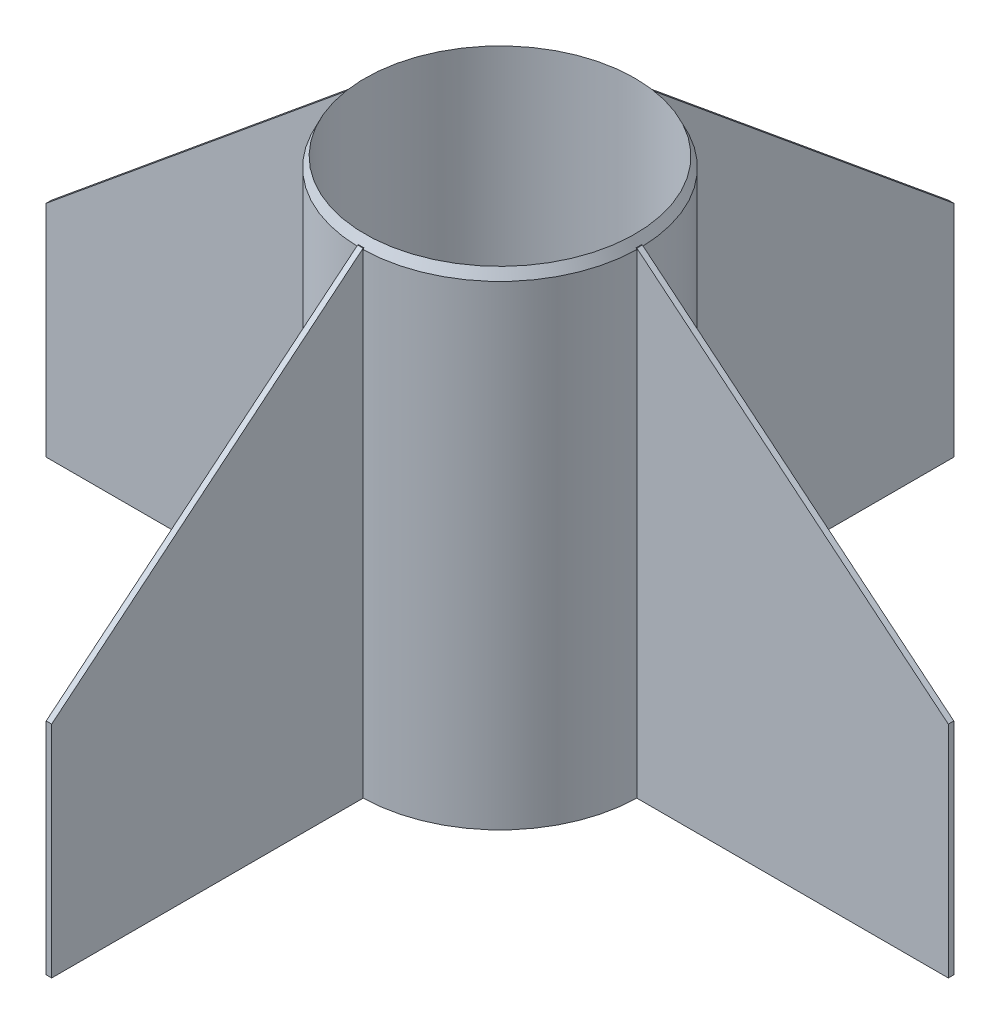
ISO-10303-21;
HEADER;
FILE_DESCRIPTION(('STEP AP214'),'2;1');
FILE_NAME('part.step','',(''),(''),'','','');
FILE_SCHEMA(('AUTOMOTIVE_DESIGN { 1 0 10303 214 1 1 1 1 }'));
ENDSEC;
DATA;
#1=APPLICATION_CONTEXT('core data for automotive mechanical design processes');
#2=APPLICATION_PROTOCOL_DEFINITION('international standard','automotive_design',2000,#1);
#3=PRODUCT_CONTEXT('',#1,'mechanical');
#4=PRODUCT('Part','Part','',(#3));
#5=PRODUCT_RELATED_PRODUCT_CATEGORY('part','',(#4));
#6=PRODUCT_DEFINITION_FORMATION('','',#4);
#7=PRODUCT_DEFINITION_CONTEXT('part definition',#1,'design');
#8=PRODUCT_DEFINITION('design','',#6,#7);
#9=PRODUCT_DEFINITION_SHAPE('','',#8);
#10=(LENGTH_UNIT() NAMED_UNIT(*) SI_UNIT(.MILLI.,.METRE.));
#11=(NAMED_UNIT(*) PLANE_ANGLE_UNIT() SI_UNIT($,.RADIAN.));
#12=(NAMED_UNIT(*) SI_UNIT($,.STERADIAN.) SOLID_ANGLE_UNIT());
#13=UNCERTAINTY_MEASURE_WITH_UNIT(LENGTH_MEASURE(1.E-05),#10,'distance_accuracy_value','');
#14=(GEOMETRIC_REPRESENTATION_CONTEXT(3) GLOBAL_UNCERTAINTY_ASSIGNED_CONTEXT((#13)) GLOBAL_UNIT_ASSIGNED_CONTEXT((#10,
#11,#12)) REPRESENTATION_CONTEXT('',''));
#15=CARTESIAN_POINT('',(0.,0.,0.));
#16=DIRECTION('',(0.,0.,1.));
#17=DIRECTION('',(1.,0.,0.));
#18=AXIS2_PLACEMENT_3D('',#15,#16,#17);
#19=CARTESIAN_POINT('',(0.,260.,0.));
#20=DIRECTION('',(0.,-1.,0.));
#21=DIRECTION('',(0.,0.,-1.));
#22=AXIS2_PLACEMENT_3D('',#19,#20,#21);
#23=CYLINDRICAL_SURFACE('',#22,76.2);
#24=DIRECTION('',(0.,-1.,0.));
#25=VECTOR('',#24,1.);
#26=CARTESIAN_POINT('',(-76.1852347899513,260.,-1.5));
#27=LINE('',#26,#25);
#28=CARTESIAN_POINT('',(-76.1852347899513,0.,-1.5));
#29=VERTEX_POINT('',#28);
#30=CARTESIAN_POINT('',(-76.1852347899513,259.277465397452,-1.5));
#31=VERTEX_POINT('',#30);
#32=EDGE_CURVE('E332',#29,#31,#27,.F.);
#33=ORIENTED_EDGE('',*,*,#32,.T.);
#34=CARTESIAN_POINT('',(0.,259.277465397452,0.));
#35=DIRECTION('',(0.,1.,0.));
#36=DIRECTION('',(0.,0.,1.));
#37=AXIS2_PLACEMENT_3D('',#34,#35,#36);
#38=CIRCLE('',#37,76.2);
#39=CARTESIAN_POINT('',(-1.4999999999992,259.277465397452,-76.1852347899513));
#40=VERTEX_POINT('',#39);
#41=EDGE_CURVE('E455',#31,#40,#38,.F.);
#42=ORIENTED_EDGE('',*,*,#41,.T.);
#43=DIRECTION('',(0.,-1.,0.));
#44=VECTOR('',#43,1.);
#45=CARTESIAN_POINT('',(-1.4999999999992,260.,-76.1852347899513));
#46=LINE('',#45,#44);
#47=CARTESIAN_POINT('',(-1.4999999999992,0.,-76.1852347899513));
#48=VERTEX_POINT('',#47);
#49=EDGE_CURVE('E291',#48,#40,#46,.F.);
#50=ORIENTED_EDGE('',*,*,#49,.F.);
#51=CARTESIAN_POINT('',(0.,0.,0.));
#52=DIRECTION('',(0.,1.,0.));
#53=DIRECTION('',(0.,0.,1.));
#54=AXIS2_PLACEMENT_3D('',#51,#52,#53);
#55=CIRCLE('',#54,76.2);
#56=EDGE_CURVE('E434',#48,#29,#55,.T.);
#57=ORIENTED_EDGE('',*,*,#56,.T.);
#58=EDGE_LOOP('',(#33,#42,#50,#57));
#59=FACE_BOUND('',#58,.T.);
#60=ADVANCED_FACE('F43',(#59),#23,.T.);
#61=DIRECTION('',(0.,-1.,0.));
#62=VECTOR('',#61,1.);
#63=CARTESIAN_POINT('',(1.5000000000008,260.,-76.1852347899513));
#64=LINE('',#63,#62);
#65=CARTESIAN_POINT('',(1.5000000000008,0.,-76.1852347899513));
#66=VERTEX_POINT('',#65);
#67=CARTESIAN_POINT('',(1.5000000000008,259.277465397452,-76.1852347899513));
#68=VERTEX_POINT('',#67);
#69=EDGE_CURVE('E241',#66,#68,#64,.F.);
#70=ORIENTED_EDGE('',*,*,#69,.T.);
#71=CARTESIAN_POINT('',(0.,259.277465397452,0.));
#72=DIRECTION('',(0.,1.,0.));
#73=DIRECTION('',(0.,0.,1.));
#74=AXIS2_PLACEMENT_3D('',#71,#72,#73);
#75=CIRCLE('',#74,76.2);
#76=CARTESIAN_POINT('',(76.1852347899513,259.277465397452,-1.5));
#77=VERTEX_POINT('',#76);
#78=EDGE_CURVE('E452',#68,#77,#75,.F.);
#79=ORIENTED_EDGE('',*,*,#78,.T.);
#80=DIRECTION('',(0.,-1.,0.));
#81=VECTOR('',#80,1.);
#82=CARTESIAN_POINT('',(76.1852347899513,260.,-1.5));
#83=LINE('',#82,#81);
#84=CARTESIAN_POINT('',(76.1852347899513,0.,-1.5));
#85=VERTEX_POINT('',#84);
#86=EDGE_CURVE('E438',#85,#77,#83,.F.);
#87=ORIENTED_EDGE('',*,*,#86,.F.);
#88=EDGE_CURVE('E430',#85,#66,#55,.T.);
#89=ORIENTED_EDGE('',*,*,#88,.T.);
#90=EDGE_LOOP('',(#70,#79,#87,#89));
#91=FACE_BOUND('',#90,.T.);
#92=ADVANCED_FACE('F611',(#91),#23,.T.);
#93=DIRECTION('',(0.,-1.,0.));
#94=VECTOR('',#93,1.);
#95=CARTESIAN_POINT('',(76.1852347899513,260.,1.5));
#96=LINE('',#95,#94);
#97=CARTESIAN_POINT('',(76.1852347899513,0.,1.5));
#98=VERTEX_POINT('',#97);
#99=CARTESIAN_POINT('',(76.1852347899513,259.277465397452,1.5));
#100=VERTEX_POINT('',#99);
#101=EDGE_CURVE('E433',#98,#100,#96,.F.);
#102=ORIENTED_EDGE('',*,*,#101,.T.);
#103=CARTESIAN_POINT('',(0.,259.277465397452,0.));
#104=DIRECTION('',(0.,1.,0.));
#105=DIRECTION('',(0.,0.,1.));
#106=AXIS2_PLACEMENT_3D('',#103,#104,#105);
#107=CIRCLE('',#106,76.2);
#108=CARTESIAN_POINT('',(1.49999999999973,259.277465397452,76.1852347899513));
#109=VERTEX_POINT('',#108);
#110=EDGE_CURVE('E449',#100,#109,#107,.F.);
#111=ORIENTED_EDGE('',*,*,#110,.T.);
#112=DIRECTION('',(0.,-1.,0.));
#113=VECTOR('',#112,1.);
#114=CARTESIAN_POINT('',(1.49999999999973,260.,76.1852347899513));
#115=LINE('',#114,#113);
#116=CARTESIAN_POINT('',(1.49999999999973,0.,76.1852347899513));
#117=VERTEX_POINT('',#116);
#118=EDGE_CURVE('E384',#117,#109,#115,.F.);
#119=ORIENTED_EDGE('',*,*,#118,.F.);
#120=EDGE_CURVE('E429',#117,#98,#55,.T.);
#121=ORIENTED_EDGE('',*,*,#120,.T.);
#122=EDGE_LOOP('',(#102,#111,#119,#121));
#123=FACE_BOUND('',#122,.T.);
#124=ADVANCED_FACE('F537',(#123),#23,.T.);
#125=DIRECTION('',(0.,-1.,0.));
#126=VECTOR('',#125,1.);
#127=CARTESIAN_POINT('',(-1.50000000000027,260.,76.1852347899513));
#128=LINE('',#127,#126);
#129=CARTESIAN_POINT('',(-1.50000000000027,0.,76.1852347899513));
#130=VERTEX_POINT('',#129);
#131=CARTESIAN_POINT('',(-1.50000000000027,259.277465397452,76.1852347899513));
#132=VERTEX_POINT('',#131);
#133=EDGE_CURVE('E380',#130,#132,#128,.F.);
#134=ORIENTED_EDGE('',*,*,#133,.T.);
#135=CARTESIAN_POINT('',(0.,259.277465397452,0.));
#136=DIRECTION('',(0.,1.,0.));
#137=DIRECTION('',(0.,0.,1.));
#138=AXIS2_PLACEMENT_3D('',#135,#136,#137);
#139=CIRCLE('',#138,76.2);
#140=CARTESIAN_POINT('',(-76.1852347899513,259.277465397452,1.5));
#141=VERTEX_POINT('',#140);
#142=EDGE_CURVE('E446',#132,#141,#139,.F.);
#143=ORIENTED_EDGE('',*,*,#142,.T.);
#144=DIRECTION('',(0.,-1.,0.));
#145=VECTOR('',#144,1.);
#146=CARTESIAN_POINT('',(-76.1852347899513,260.,1.5));
#147=LINE('',#146,#145);
#148=CARTESIAN_POINT('',(-76.1852347899513,0.,1.5));
#149=VERTEX_POINT('',#148);
#150=EDGE_CURVE('E336',#149,#141,#147,.F.);
#151=ORIENTED_EDGE('',*,*,#150,.F.);
#152=EDGE_CURVE('E527',#149,#130,#55,.T.);
#153=ORIENTED_EDGE('',*,*,#152,.T.);
#154=EDGE_LOOP('',(#134,#143,#151,#153));
#155=FACE_BOUND('',#154,.T.);
#156=ADVANCED_FACE('F617',(#155),#23,.T.);
#157=CARTESIAN_POINT('',(0.,260.,0.));
#158=DIRECTION('',(0.,1.,0.));
#159=DIRECTION('',(0.,0.,1.));
#160=AXIS2_PLACEMENT_3D('',#157,#158,#159);
#161=PLANE('',#160);
#162=DIRECTION('',(-1.,0.,0.));
#163=VECTOR('',#162,1.);
#164=CARTESIAN_POINT('',(76.2,260.,-1.5));
#165=LINE('',#164,#163);
#166=CARTESIAN_POINT('',(76.2,260.,-1.5));
#167=VERTEX_POINT('',#166);
#168=CARTESIAN_POINT('',(75.8482457833937,260.,-1.5));
#169=VERTEX_POINT('',#168);
#170=EDGE_CURVE('E98',#167,#169,#165,.T.);
#171=ORIENTED_EDGE('',*,*,#170,.T.);
#172=CARTESIAN_POINT('',(0.,260.,0.));
#173=DIRECTION('',(0.,1.,0.));
#174=DIRECTION('',(0.,0.,1.));
#175=AXIS2_PLACEMENT_3D('',#172,#173,#174);
#176=CIRCLE('',#175,75.8630765815499);
#177=CARTESIAN_POINT('',(75.8482457833937,260.,1.5));
#178=VERTEX_POINT('',#177);
#179=EDGE_CURVE('E555',#169,#178,#176,.F.);
#180=ORIENTED_EDGE('',*,*,#179,.T.);
#181=DIRECTION('',(-1.,0.,0.));
#182=VECTOR('',#181,1.);
#183=CARTESIAN_POINT('',(76.2,260.,1.5));
#184=LINE('',#183,#182);
#185=CARTESIAN_POINT('',(76.2,260.,1.5));
#186=VERTEX_POINT('',#185);
#187=EDGE_CURVE('E91',#186,#178,#184,.T.);
#188=ORIENTED_EDGE('',*,*,#187,.F.);
#189=DIRECTION('',(0.,0.,1.));
#190=VECTOR('',#189,1.);
#191=CARTESIAN_POINT('',(76.2,260.,-1.5));
#192=LINE('',#191,#190);
#193=CARTESIAN_POINT('',(76.2,260.,0.));
#194=VERTEX_POINT('',#193);
#195=EDGE_CURVE('E420',#194,#186,#192,.T.);
#196=ORIENTED_EDGE('',*,*,#195,.F.);
#197=EDGE_CURVE('E421',#167,#194,#192,.T.);
#198=ORIENTED_EDGE('',*,*,#197,.F.);
#199=EDGE_LOOP('',(#171,#180,#188,#196,#198));
#200=FACE_BOUND('',#199,.T.);
#201=ADVANCED_FACE('F553',(#200),#161,.T.);
#202=CARTESIAN_POINT('',(0.,0.,0.));
#203=DIRECTION('',(0.,1.,0.));
#204=DIRECTION('',(0.,0.,1.));
#205=AXIS2_PLACEMENT_3D('',#202,#203,#204);
#206=PLANE('',#205);
#207=ORIENTED_EDGE('',*,*,#152,.F.);
#208=DIRECTION('',(-1.,0.,0.));
#209=VECTOR('',#208,1.);
#210=CARTESIAN_POINT('',(-74.2,0.,1.5));
#211=LINE('',#210,#209);
#212=CARTESIAN_POINT('',(-246.2,0.,1.5));
#213=VERTEX_POINT('',#212);
#214=EDGE_CURVE('E324',#149,#213,#211,.T.);
#215=ORIENTED_EDGE('',*,*,#214,.T.);
#216=DIRECTION('',(0.,0.,-1.));
#217=VECTOR('',#216,1.);
#218=CARTESIAN_POINT('',(-246.2,0.,1.5));
#219=LINE('',#218,#217);
#220=CARTESIAN_POINT('',(-246.2,0.,-1.5));
#221=VERTEX_POINT('',#220);
#222=EDGE_CURVE('E310',#213,#221,#219,.T.);
#223=ORIENTED_EDGE('',*,*,#222,.T.);
#224=DIRECTION('',(-1.,0.,0.));
#225=VECTOR('',#224,1.);
#226=CARTESIAN_POINT('',(-74.2,0.,-1.5));
#227=LINE('',#226,#225);
#228=EDGE_CURVE('E319',#29,#221,#227,.T.);
#229=ORIENTED_EDGE('',*,*,#228,.F.);
#230=ORIENTED_EDGE('',*,*,#56,.F.);
#231=DIRECTION('',(0.,0.,-1.));
#232=VECTOR('',#231,1.);
#233=CARTESIAN_POINT('',(-1.49999999999922,0.,-74.2));
#234=LINE('',#233,#232);
#235=CARTESIAN_POINT('',(-1.49999999999742,0.,-246.2));
#236=VERTEX_POINT('',#235);
#237=EDGE_CURVE('E255',#48,#236,#234,.T.);
#238=ORIENTED_EDGE('',*,*,#237,.T.);
#239=DIRECTION('',(1.,0.,0.));
#240=VECTOR('',#239,1.);
#241=CARTESIAN_POINT('',(-1.49999999999742,0.,-246.2));
#242=LINE('',#241,#240);
#243=CARTESIAN_POINT('',(1.50000000000258,0.,-246.2));
#244=VERTEX_POINT('',#243);
#245=EDGE_CURVE('E250',#236,#244,#242,.T.);
#246=ORIENTED_EDGE('',*,*,#245,.T.);
#247=DIRECTION('',(0.,0.,-1.));
#248=VECTOR('',#247,1.);
#249=CARTESIAN_POINT('',(1.50000000000078,0.,-74.2));
#250=LINE('',#249,#248);
#251=EDGE_CURVE('E233',#66,#244,#250,.T.);
#252=ORIENTED_EDGE('',*,*,#251,.F.);
#253=ORIENTED_EDGE('',*,*,#88,.F.);
#254=DIRECTION('',(1.,0.,0.));
#255=VECTOR('',#254,1.);
#256=CARTESIAN_POINT('',(74.2,0.,-1.5));
#257=LINE('',#256,#255);
#258=CARTESIAN_POINT('',(246.2,0.,-1.5));
#259=VERTEX_POINT('',#258);
#260=EDGE_CURVE('E417',#85,#259,#257,.T.);
#261=ORIENTED_EDGE('',*,*,#260,.T.);
#262=DIRECTION('',(0.,0.,1.));
#263=VECTOR('',#262,1.);
#264=CARTESIAN_POINT('',(246.2,0.,-1.5));
#265=LINE('',#264,#263);
#266=CARTESIAN_POINT('',(246.2,0.,1.5));
#267=VERTEX_POINT('',#266);
#268=EDGE_CURVE('E403',#259,#267,#265,.T.);
#269=ORIENTED_EDGE('',*,*,#268,.T.);
#270=DIRECTION('',(1.,0.,0.));
#271=VECTOR('',#270,1.);
#272=CARTESIAN_POINT('',(74.2,0.,1.5));
#273=LINE('',#272,#271);
#274=EDGE_CURVE('E412',#98,#267,#273,.T.);
#275=ORIENTED_EDGE('',*,*,#274,.F.);
#276=ORIENTED_EDGE('',*,*,#120,.F.);
#277=DIRECTION('',(0.,0.,1.));
#278=VECTOR('',#277,1.);
#279=CARTESIAN_POINT('',(1.49999999999974,0.,74.2));
#280=LINE('',#279,#278);
#281=CARTESIAN_POINT('',(1.49999999999914,0.,246.2));
#282=VERTEX_POINT('',#281);
#283=EDGE_CURVE('E372',#117,#282,#280,.T.);
#284=ORIENTED_EDGE('',*,*,#283,.T.);
#285=DIRECTION('',(-1.,0.,0.));
#286=VECTOR('',#285,1.);
#287=CARTESIAN_POINT('',(1.49999999999914,0.,246.2));
#288=LINE('',#287,#286);
#289=CARTESIAN_POINT('',(-1.50000000000086,0.,246.2));
#290=VERTEX_POINT('',#289);
#291=EDGE_CURVE('E356',#282,#290,#288,.T.);
#292=ORIENTED_EDGE('',*,*,#291,.T.);
#293=DIRECTION('',(0.,0.,1.));
#294=VECTOR('',#293,1.);
#295=CARTESIAN_POINT('',(-1.50000000000026,0.,74.2));
#296=LINE('',#295,#294);
#297=EDGE_CURVE('E366',#130,#290,#296,.T.);
#298=ORIENTED_EDGE('',*,*,#297,.F.);
#299=EDGE_LOOP('',(#207,#215,#223,#229,#230,#238,#246,#252,#253,#261,#269,#275,#276,#284,#292,#298));
#300=FACE_BOUND('',#299,.T.);
#301=CARTESIAN_POINT('',(0.,0.,0.));
#302=DIRECTION('',(0.,1.,0.));
#303=DIRECTION('',(0.,0.,1.));
#304=AXIS2_PLACEMENT_3D('',#301,#302,#303);
#305=CIRCLE('',#304,73.7);
#306=CARTESIAN_POINT('',(0.,0.,73.7));
#307=VERTEX_POINT('',#306);
#308=EDGE_CURVE('E425',#307,#307,#305,.T.);
#309=ORIENTED_EDGE('',*,*,#308,.T.);
#310=EDGE_LOOP('',(#309));
#311=FACE_BOUND('',#310,.T.);
#312=ADVANCED_FACE('F252',(#300,#311),#206,.F.);
#313=CARTESIAN_POINT('',(0.,260.,0.));
#314=DIRECTION('',(0.,-1.,0.));
#315=DIRECTION('',(0.,0.,-1.));
#316=AXIS2_PLACEMENT_3D('',#313,#314,#315);
#317=CYLINDRICAL_SURFACE('',#316,73.7);
#318=CARTESIAN_POINT('',(0.,264.638732698726,0.));
#319=DIRECTION('',(0.,-1.,0.));
#320=DIRECTION('',(0.,0.,-1.));
#321=AXIS2_PLACEMENT_3D('',#318,#319,#320);
#322=CIRCLE('',#321,73.7);
#323=CARTESIAN_POINT('',(0.,264.638732698726,-73.7));
#324=VERTEX_POINT('',#323);
#325=EDGE_CURVE('E442',#324,#324,#322,.F.);
#326=ORIENTED_EDGE('',*,*,#325,.T.);
#327=EDGE_LOOP('',(#326));
#328=FACE_BOUND('',#327,.T.);
#329=ORIENTED_EDGE('',*,*,#308,.F.);
#330=EDGE_LOOP('',(#329));
#331=FACE_BOUND('',#330,.T.);
#332=ADVANCED_FACE('F588',(#328,#331),#317,.F.);
#333=CARTESIAN_POINT('',(0.,0.,-1.5));
#334=DIRECTION('',(0.,0.,1.));
#335=DIRECTION('',(1.,0.,0.));
#336=AXIS2_PLACEMENT_3D('',#333,#334,#335);
#337=PLANE('',#336);
#338=ORIENTED_EDGE('',*,*,#260,.F.);
#339=ORIENTED_EDGE('',*,*,#86,.T.);
#340=CARTESIAN_POINT('',(76.1852347899513,259.277465397452,-1.5));
#341=CARTESIAN_POINT('',(76.1290699953228,259.397887849772,-1.5));
#342=CARTESIAN_POINT('',(76.0729051807955,259.51831029281,-1.5));
#343=CARTESIAN_POINT('',(75.960575511943,259.759155160326,-1.5));
#344=CARTESIAN_POINT('',(75.9044106576178,259.879577584804,-1.5));
#345=CARTESIAN_POINT('',(75.8482457833937,260.,-1.5));
#346=B_SPLINE_CURVE_WITH_KNOTS('',3,(#340,#341,#342,#343,#344,#345),.UNSPECIFIED.,.F.,.F.,(4,2,
4),(0.,0.398628223542886,0.797256447085857),.UNSPECIFIED.);
#347=EDGE_CURVE('E558',#77,#169,#346,.T.);
#348=ORIENTED_EDGE('',*,*,#347,.T.);
#349=ORIENTED_EDGE('',*,*,#170,.F.);
#350=DIRECTION('',(-0.77193023561705,0.6357072528611,0.));
#351=VECTOR('',#350,1.);
#352=CARTESIAN_POINT('',(246.2,120.,-1.5));
#353=LINE('',#352,#351);
#354=CARTESIAN_POINT('',(246.2,120.,-1.5));
#355=VERTEX_POINT('',#354);
#356=EDGE_CURVE('E399',#355,#167,#353,.T.);
#357=ORIENTED_EDGE('',*,*,#356,.F.);
#358=DIRECTION('',(0.,1.,0.));
#359=VECTOR('',#358,1.);
#360=CARTESIAN_POINT('',(246.2,0.,-1.5));
#361=LINE('',#360,#359);
#362=EDGE_CURVE('E395',#259,#355,#361,.T.);
#363=ORIENTED_EDGE('',*,*,#362,.F.);
#364=EDGE_LOOP('',(#338,#339,#348,#349,#357,#363));
#365=FACE_BOUND('',#364,.T.);
#366=ADVANCED_FACE('F583',(#365),#337,.F.);
#367=CARTESIAN_POINT('',(0.,0.,1.5));
#368=DIRECTION('',(0.,0.,1.));
#369=DIRECTION('',(1.,0.,0.));
#370=AXIS2_PLACEMENT_3D('',#367,#368,#369);
#371=PLANE('',#370);
#372=ORIENTED_EDGE('',*,*,#101,.F.);
#373=ORIENTED_EDGE('',*,*,#274,.T.);
#374=DIRECTION('',(0.,1.,0.));
#375=VECTOR('',#374,1.);
#376=CARTESIAN_POINT('',(246.2,0.,1.5));
#377=LINE('',#376,#375);
#378=CARTESIAN_POINT('',(246.2,120.,1.5));
#379=VERTEX_POINT('',#378);
#380=EDGE_CURVE('E388',#267,#379,#377,.T.);
#381=ORIENTED_EDGE('',*,*,#380,.T.);
#382=DIRECTION('',(-0.77193023561705,0.6357072528611,0.));
#383=VECTOR('',#382,1.);
#384=CARTESIAN_POINT('',(246.2,120.,1.5));
#385=LINE('',#384,#383);
#386=EDGE_CURVE('E392',#379,#186,#385,.T.);
#387=ORIENTED_EDGE('',*,*,#386,.T.);
#388=ORIENTED_EDGE('',*,*,#187,.T.);
#389=CARTESIAN_POINT('',(75.8482457833937,260.,1.5));
#390=CARTESIAN_POINT('',(75.9044106576178,259.879577584804,1.5));
#391=CARTESIAN_POINT('',(75.960575511943,259.759155160326,1.5));
#392=CARTESIAN_POINT('',(76.0729051807955,259.51831029281,1.5));
#393=CARTESIAN_POINT('',(76.1290699953228,259.397887849772,1.5));
#394=CARTESIAN_POINT('',(76.1852347899513,259.277465397452,1.5));
#395=B_SPLINE_CURVE_WITH_KNOTS('',3,(#389,#390,#391,#392,#393,#394),.UNSPECIFIED.,.F.,.F.,(4,2,
4),(0.,0.398628223542965,0.797256447085851),.UNSPECIFIED.);
#396=EDGE_CURVE('E542',#178,#100,#395,.T.);
#397=ORIENTED_EDGE('',*,*,#396,.T.);
#398=EDGE_LOOP('',(#372,#373,#381,#387,#388,#397));
#399=FACE_BOUND('',#398,.T.);
#400=ADVANCED_FACE('F540',(#399),#371,.T.);
#401=CARTESIAN_POINT('',(246.2,120.,-1.5));
#402=DIRECTION('',(0.6357072528611,0.77193023561705,0.));
#403=DIRECTION('',(-0.77193023561705,0.6357072528611,0.));
#404=AXIS2_PLACEMENT_3D('',#401,#402,#403);
#405=PLANE('',#404);
#406=ORIENTED_EDGE('',*,*,#197,.T.);
#407=ORIENTED_EDGE('',*,*,#195,.T.);
#408=ORIENTED_EDGE('',*,*,#386,.F.);
#409=DIRECTION('',(0.,0.,1.));
#410=VECTOR('',#409,1.);
#411=CARTESIAN_POINT('',(246.2,120.,-1.5));
#412=LINE('',#411,#410);
#413=EDGE_CURVE('E404',#355,#379,#412,.T.);
#414=ORIENTED_EDGE('',*,*,#413,.F.);
#415=ORIENTED_EDGE('',*,*,#356,.T.);
#416=EDGE_LOOP('',(#406,#407,#408,#414,#415));
#417=FACE_BOUND('',#416,.T.);
#418=ADVANCED_FACE('F550',(#417),#405,.T.);
#419=CARTESIAN_POINT('',(246.2,0.,-1.5));
#420=DIRECTION('',(1.,0.,0.));
#421=DIRECTION('',(0.,0.,-1.));
#422=AXIS2_PLACEMENT_3D('',#419,#420,#421);
#423=PLANE('',#422);
#424=ORIENTED_EDGE('',*,*,#413,.T.);
#425=ORIENTED_EDGE('',*,*,#380,.F.);
#426=ORIENTED_EDGE('',*,*,#268,.F.);
#427=ORIENTED_EDGE('',*,*,#362,.T.);
#428=EDGE_LOOP('',(#424,#425,#426,#427));
#429=FACE_BOUND('',#428,.T.);
#430=ADVANCED_FACE('F547',(#429),#423,.T.);
#431=CARTESIAN_POINT('',(0.,260.,0.));
#432=DIRECTION('',(0.,1.,0.));
#433=DIRECTION('',(-1.,0.,0.));
#434=AXIS2_PLACEMENT_3D('',#431,#432,#433);
#435=PLANE('',#434);
#436=DIRECTION('',(0.,0.,-1.));
#437=VECTOR('',#436,1.);
#438=CARTESIAN_POINT('',(1.49999999999973,260.,76.2));
#439=LINE('',#438,#437);
#440=CARTESIAN_POINT('',(1.49999999999973,260.,76.2));
#441=VERTEX_POINT('',#440);
#442=CARTESIAN_POINT('',(1.49999999999974,260.,75.8482457833937));
#443=VERTEX_POINT('',#442);
#444=EDGE_CURVE('E369',#441,#443,#439,.T.);
#445=ORIENTED_EDGE('',*,*,#444,.T.);
#446=CARTESIAN_POINT('',(0.,260.,0.));
#447=DIRECTION('',(0.,1.,0.));
#448=DIRECTION('',(0.,0.,1.));
#449=AXIS2_PLACEMENT_3D('',#446,#447,#448);
#450=CIRCLE('',#449,75.8630765815499);
#451=CARTESIAN_POINT('',(-1.50000000000026,260.,75.8482457833937));
#452=VERTEX_POINT('',#451);
#453=EDGE_CURVE('E566',#443,#452,#450,.F.);
#454=ORIENTED_EDGE('',*,*,#453,.T.);
#455=DIRECTION('',(0.,0.,-1.));
#456=VECTOR('',#455,1.);
#457=CARTESIAN_POINT('',(-1.50000000000027,260.,76.2));
#458=LINE('',#457,#456);
#459=CARTESIAN_POINT('',(-1.50000000000027,260.,76.2));
#460=VERTEX_POINT('',#459);
#461=EDGE_CURVE('E360',#460,#452,#458,.T.);
#462=ORIENTED_EDGE('',*,*,#461,.F.);
#463=DIRECTION('',(-1.,0.,0.));
#464=VECTOR('',#463,1.);
#465=CARTESIAN_POINT('',(1.49999999999973,260.,76.2));
#466=LINE('',#465,#464);
#467=CARTESIAN_POINT('',(-2.66050878019847E-13,260.,76.2));
#468=VERTEX_POINT('',#467);
#469=EDGE_CURVE('E375',#468,#460,#466,.T.);
#470=ORIENTED_EDGE('',*,*,#469,.F.);
#471=EDGE_CURVE('E376',#441,#468,#466,.T.);
#472=ORIENTED_EDGE('',*,*,#471,.F.);
#473=EDGE_LOOP('',(#445,#454,#462,#470,#472));
#474=FACE_BOUND('',#473,.T.);
#475=ADVANCED_FACE('F657',(#474),#435,.T.);
#476=CARTESIAN_POINT('',(1.5,0.,0.));
#477=DIRECTION('',(-1.,0.,0.));
#478=DIRECTION('',(0.,0.,1.));
#479=AXIS2_PLACEMENT_3D('',#476,#477,#478);
#480=PLANE('',#479);
#481=ORIENTED_EDGE('',*,*,#283,.F.);
#482=ORIENTED_EDGE('',*,*,#118,.T.);
#483=CARTESIAN_POINT('',(1.49999999999973,259.277465397452,76.1852347899513));
#484=CARTESIAN_POINT('',(1.49999999999973,259.397887849772,76.1290699953229));
#485=CARTESIAN_POINT('',(1.49999999999973,259.51831029281,76.0729051807955));
#486=CARTESIAN_POINT('',(1.49999999999973,259.759155160326,75.960575511943));
#487=CARTESIAN_POINT('',(1.49999999999974,259.879577584804,75.9044106576178));
#488=CARTESIAN_POINT('',(1.49999999999974,260.,75.8482457833937));
#489=B_SPLINE_CURVE_WITH_KNOTS('',3,(#483,#484,#485,#486,#487,#488),.UNSPECIFIED.,.F.,.F.,(4,2,
4),(0.,0.398628223542886,0.797256447085863),.UNSPECIFIED.);
#490=EDGE_CURVE('E562',#109,#443,#489,.T.);
#491=ORIENTED_EDGE('',*,*,#490,.T.);
#492=ORIENTED_EDGE('',*,*,#444,.F.);
#493=DIRECTION('',(0.,0.6357072528611,-0.77193023561705));
#494=VECTOR('',#493,1.);
#495=CARTESIAN_POINT('',(1.49999999999914,120.,246.2));
#496=LINE('',#495,#494);
#497=CARTESIAN_POINT('',(1.49999999999914,120.,246.2));
#498=VERTEX_POINT('',#497);
#499=EDGE_CURVE('E352',#498,#441,#496,.T.);
#500=ORIENTED_EDGE('',*,*,#499,.F.);
#501=DIRECTION('',(0.,1.,0.));
#502=VECTOR('',#501,1.);
#503=CARTESIAN_POINT('',(1.49999999999914,0.,246.2));
#504=LINE('',#503,#502);
#505=EDGE_CURVE('E348',#282,#498,#504,.T.);
#506=ORIENTED_EDGE('',*,*,#505,.F.);
#507=EDGE_LOOP('',(#481,#482,#491,#492,#500,#506));
#508=FACE_BOUND('',#507,.T.);
#509=ADVANCED_FACE('F662',(#508),#480,.F.);
#510=CARTESIAN_POINT('',(-1.5,0.,0.));
#511=DIRECTION('',(-1.,0.,0.));
#512=DIRECTION('',(0.,0.,1.));
#513=AXIS2_PLACEMENT_3D('',#510,#511,#512);
#514=PLANE('',#513);
#515=ORIENTED_EDGE('',*,*,#133,.F.);
#516=ORIENTED_EDGE('',*,*,#297,.T.);
#517=DIRECTION('',(0.,1.,0.));
#518=VECTOR('',#517,1.);
#519=CARTESIAN_POINT('',(-1.50000000000086,0.,246.2));
#520=LINE('',#519,#518);
#521=CARTESIAN_POINT('',(-1.50000000000086,120.,246.2));
#522=VERTEX_POINT('',#521);
#523=EDGE_CURVE('E340',#290,#522,#520,.T.);
#524=ORIENTED_EDGE('',*,*,#523,.T.);
#525=DIRECTION('',(0.,0.6357072528611,-0.77193023561705));
#526=VECTOR('',#525,1.);
#527=CARTESIAN_POINT('',(-1.50000000000086,120.,246.2));
#528=LINE('',#527,#526);
#529=EDGE_CURVE('E344',#522,#460,#528,.T.);
#530=ORIENTED_EDGE('',*,*,#529,.T.);
#531=ORIENTED_EDGE('',*,*,#461,.T.);
#532=CARTESIAN_POINT('',(-1.50000000000026,260.,75.8482457833937));
#533=CARTESIAN_POINT('',(-1.50000000000027,259.879577584804,75.9044106576178));
#534=CARTESIAN_POINT('',(-1.50000000000027,259.759155160326,75.960575511943));
#535=CARTESIAN_POINT('',(-1.50000000000027,259.51831029281,76.0729051807955));
#536=CARTESIAN_POINT('',(-1.50000000000027,259.397887849772,76.1290699953228));
#537=CARTESIAN_POINT('',(-1.50000000000027,259.277465397452,76.1852347899513));
#538=B_SPLINE_CURVE_WITH_KNOTS('',3,(#532,#533,#534,#535,#536,#537),.UNSPECIFIED.,.F.,.F.,(4,2,
4),(0.,0.398628223542971,0.797256447085851),.UNSPECIFIED.);
#539=EDGE_CURVE('E508',#452,#132,#538,.T.);
#540=ORIENTED_EDGE('',*,*,#539,.T.);
#541=EDGE_LOOP('',(#515,#516,#524,#530,#531,#540));
#542=FACE_BOUND('',#541,.T.);
#543=ADVANCED_FACE('F670',(#542),#514,.T.);
#544=CARTESIAN_POINT('',(1.49999999999914,120.,246.2));
#545=DIRECTION('',(0.,0.77193023561705,0.6357072528611));
#546=DIRECTION('',(0.,0.6357072528611,-0.77193023561705));
#547=AXIS2_PLACEMENT_3D('',#544,#545,#546);
#548=PLANE('',#547);
#549=ORIENTED_EDGE('',*,*,#471,.T.);
#550=ORIENTED_EDGE('',*,*,#469,.T.);
#551=ORIENTED_EDGE('',*,*,#529,.F.);
#552=DIRECTION('',(-1.,0.,0.));
#553=VECTOR('',#552,1.);
#554=CARTESIAN_POINT('',(1.49999999999914,120.,246.2));
#555=LINE('',#554,#553);
#556=EDGE_CURVE('E357',#498,#522,#555,.T.);
#557=ORIENTED_EDGE('',*,*,#556,.F.);
#558=ORIENTED_EDGE('',*,*,#499,.T.);
#559=EDGE_LOOP('',(#549,#550,#551,#557,#558));
#560=FACE_BOUND('',#559,.T.);
#561=ADVANCED_FACE('F677',(#560),#548,.T.);
#562=CARTESIAN_POINT('',(1.49999999999914,0.,246.2));
#563=DIRECTION('',(0.,0.,1.));
#564=DIRECTION('',(1.,0.,0.));
#565=AXIS2_PLACEMENT_3D('',#562,#563,#564);
#566=PLANE('',#565);
#567=ORIENTED_EDGE('',*,*,#556,.T.);
#568=ORIENTED_EDGE('',*,*,#523,.F.);
#569=ORIENTED_EDGE('',*,*,#291,.F.);
#570=ORIENTED_EDGE('',*,*,#505,.T.);
#571=EDGE_LOOP('',(#567,#568,#569,#570));
#572=FACE_BOUND('',#571,.T.);
#573=ADVANCED_FACE('F684',(#572),#566,.T.);
#574=CARTESIAN_POINT('',(0.,260.,0.));
#575=DIRECTION('',(0.,1.,0.));
#576=DIRECTION('',(0.,0.,-1.));
#577=AXIS2_PLACEMENT_3D('',#574,#575,#576);
#578=PLANE('',#577);
#579=DIRECTION('',(1.,0.,0.));
#580=VECTOR('',#579,1.);
#581=CARTESIAN_POINT('',(-76.2,260.,1.5));
#582=LINE('',#581,#580);
#583=CARTESIAN_POINT('',(-76.2,260.,1.5));
#584=VERTEX_POINT('',#583);
#585=CARTESIAN_POINT('',(-75.8482457833937,260.,1.5));
#586=VERTEX_POINT('',#585);
#587=EDGE_CURVE('E73',#584,#586,#582,.T.);
#588=ORIENTED_EDGE('',*,*,#587,.T.);
#589=CARTESIAN_POINT('',(0.,260.,0.));
#590=DIRECTION('',(0.,1.,0.));
#591=DIRECTION('',(0.,0.,1.));
#592=AXIS2_PLACEMENT_3D('',#589,#590,#591);
#593=CIRCLE('',#592,75.8630765815499);
#594=CARTESIAN_POINT('',(-75.8482457833937,260.,-1.5));
#595=VERTEX_POINT('',#594);
#596=EDGE_CURVE('E59',#586,#595,#593,.F.);
#597=ORIENTED_EDGE('',*,*,#596,.T.);
#598=DIRECTION('',(1.,0.,0.));
#599=VECTOR('',#598,1.);
#600=CARTESIAN_POINT('',(-76.2,260.,-1.5));
#601=LINE('',#600,#599);
#602=CARTESIAN_POINT('',(-76.2,260.,-1.5));
#603=VERTEX_POINT('',#602);
#604=EDGE_CURVE('E65',#603,#595,#601,.T.);
#605=ORIENTED_EDGE('',*,*,#604,.F.);
#606=DIRECTION('',(0.,0.,-1.));
#607=VECTOR('',#606,1.);
#608=CARTESIAN_POINT('',(-76.2,260.,1.5));
#609=LINE('',#608,#607);
#610=CARTESIAN_POINT('',(-76.2,260.,0.));
#611=VERTEX_POINT('',#610);
#612=EDGE_CURVE('E327',#611,#603,#609,.T.);
#613=ORIENTED_EDGE('',*,*,#612,.F.);
#614=EDGE_CURVE('E328',#584,#611,#609,.T.);
#615=ORIENTED_EDGE('',*,*,#614,.F.);
#616=EDGE_LOOP('',(#588,#597,#605,#613,#615));
#617=FACE_BOUND('',#616,.T.);
#618=ADVANCED_FACE('F497',(#617),#578,.T.);
#619=CARTESIAN_POINT('',(0.,0.,1.5));
#620=DIRECTION('',(0.,0.,-1.));
#621=DIRECTION('',(-1.,0.,0.));
#622=AXIS2_PLACEMENT_3D('',#619,#620,#621);
#623=PLANE('',#622);
#624=ORIENTED_EDGE('',*,*,#214,.F.);
#625=ORIENTED_EDGE('',*,*,#150,.T.);
#626=CARTESIAN_POINT('',(-76.1852347899513,259.277465397452,1.5));
#627=CARTESIAN_POINT('',(-76.1290699953228,259.397887849772,1.5));
#628=CARTESIAN_POINT('',(-76.0729051807955,259.51831029281,1.5));
#629=CARTESIAN_POINT('',(-75.9605755119429,259.759155160326,1.5));
#630=CARTESIAN_POINT('',(-75.9044106576178,259.879577584804,1.5));
#631=CARTESIAN_POINT('',(-75.8482457833937,260.,1.5));
#632=B_SPLINE_CURVE_WITH_KNOTS('',3,(#626,#627,#628,#629,#630,#631),.UNSPECIFIED.,.F.,.F.,(4,2,
4),(0.,0.398628223542892,0.797256447085863),.UNSPECIFIED.);
#633=EDGE_CURVE('E501',#141,#586,#632,.T.);
#634=ORIENTED_EDGE('',*,*,#633,.T.);
#635=ORIENTED_EDGE('',*,*,#587,.F.);
#636=DIRECTION('',(0.77193023561705,0.6357072528611,0.));
#637=VECTOR('',#636,1.);
#638=CARTESIAN_POINT('',(-246.2,120.,1.5));
#639=LINE('',#638,#637);
#640=CARTESIAN_POINT('',(-246.2,120.,1.5));
#641=VERTEX_POINT('',#640);
#642=EDGE_CURVE('E306',#641,#584,#639,.T.);
#643=ORIENTED_EDGE('',*,*,#642,.F.);
#644=DIRECTION('',(0.,1.,0.));
#645=VECTOR('',#644,1.);
#646=CARTESIAN_POINT('',(-246.2,0.,1.5));
#647=LINE('',#646,#645);
#648=EDGE_CURVE('E302',#213,#641,#647,.T.);
#649=ORIENTED_EDGE('',*,*,#648,.F.);
#650=EDGE_LOOP('',(#624,#625,#634,#635,#643,#649));
#651=FACE_BOUND('',#650,.T.);
#652=ADVANCED_FACE('F493',(#651),#623,.F.);
#653=CARTESIAN_POINT('',(0.,0.,-1.5));
#654=DIRECTION('',(0.,0.,-1.));
#655=DIRECTION('',(-1.,0.,0.));
#656=AXIS2_PLACEMENT_3D('',#653,#654,#655);
#657=PLANE('',#656);
#658=ORIENTED_EDGE('',*,*,#32,.F.);
#659=ORIENTED_EDGE('',*,*,#228,.T.);
#660=DIRECTION('',(0.,1.,0.));
#661=VECTOR('',#660,1.);
#662=CARTESIAN_POINT('',(-246.2,0.,-1.5));
#663=LINE('',#662,#661);
#664=CARTESIAN_POINT('',(-246.2,120.,-1.5));
#665=VERTEX_POINT('',#664);
#666=EDGE_CURVE('E295',#221,#665,#663,.T.);
#667=ORIENTED_EDGE('',*,*,#666,.T.);
#668=DIRECTION('',(0.77193023561705,0.6357072528611,0.));
#669=VECTOR('',#668,1.);
#670=CARTESIAN_POINT('',(-246.2,120.,-1.5));
#671=LINE('',#670,#669);
#672=EDGE_CURVE('E299',#665,#603,#671,.T.);
#673=ORIENTED_EDGE('',*,*,#672,.T.);
#674=ORIENTED_EDGE('',*,*,#604,.T.);
#675=CARTESIAN_POINT('',(-75.8482457833937,260.,-1.5));
#676=CARTESIAN_POINT('',(-75.9044106576178,259.879577584804,-1.5));
#677=CARTESIAN_POINT('',(-75.960575511943,259.759155160326,-1.5));
#678=CARTESIAN_POINT('',(-76.0729051807955,259.51831029281,-1.5));
#679=CARTESIAN_POINT('',(-76.1290699953228,259.397887849772,-1.5));
#680=CARTESIAN_POINT('',(-76.1852347899513,259.277465397452,-1.5));
#681=B_SPLINE_CURVE_WITH_KNOTS('',3,(#675,#676,#677,#678,#679,#680),.UNSPECIFIED.,.F.,.F.,(4,2,
4),(0.,0.398628223542965,0.797256447085851),.UNSPECIFIED.);
#682=EDGE_CURVE('E11',#595,#31,#681,.T.);
#683=ORIENTED_EDGE('',*,*,#682,.T.);
#684=EDGE_LOOP('',(#658,#659,#667,#673,#674,#683));
#685=FACE_BOUND('',#684,.T.);
#686=ADVANCED_FACE('F486',(#685),#657,.T.);
#687=CARTESIAN_POINT('',(-246.2,120.,1.5));
#688=DIRECTION('',(-0.6357072528611,0.77193023561705,0.));
#689=DIRECTION('',(0.77193023561705,0.6357072528611,0.));
#690=AXIS2_PLACEMENT_3D('',#687,#688,#689);
#691=PLANE('',#690);
#692=ORIENTED_EDGE('',*,*,#614,.T.);
#693=ORIENTED_EDGE('',*,*,#612,.T.);
#694=ORIENTED_EDGE('',*,*,#672,.F.);
#695=DIRECTION('',(0.,0.,-1.));
#696=VECTOR('',#695,1.);
#697=CARTESIAN_POINT('',(-246.2,120.,1.5));
#698=LINE('',#697,#696);
#699=EDGE_CURVE('E311',#641,#665,#698,.T.);
#700=ORIENTED_EDGE('',*,*,#699,.F.);
#701=ORIENTED_EDGE('',*,*,#642,.T.);
#702=EDGE_LOOP('',(#692,#693,#694,#700,#701));
#703=FACE_BOUND('',#702,.T.);
#704=ADVANCED_FACE('F483',(#703),#691,.T.);
#705=CARTESIAN_POINT('',(-246.2,0.,1.5));
#706=DIRECTION('',(-1.,0.,0.));
#707=DIRECTION('',(0.,0.,1.));
#708=AXIS2_PLACEMENT_3D('',#705,#706,#707);
#709=PLANE('',#708);
#710=ORIENTED_EDGE('',*,*,#699,.T.);
#711=ORIENTED_EDGE('',*,*,#666,.F.);
#712=ORIENTED_EDGE('',*,*,#222,.F.);
#713=ORIENTED_EDGE('',*,*,#648,.T.);
#714=EDGE_LOOP('',(#710,#711,#712,#713));
#715=FACE_BOUND('',#714,.T.);
#716=ADVANCED_FACE('F481',(#715),#709,.T.);
#717=CARTESIAN_POINT('',(0.,260.,0.));
#718=DIRECTION('',(0.,1.,0.));
#719=DIRECTION('',(1.,0.,0.));
#720=AXIS2_PLACEMENT_3D('',#717,#718,#719);
#721=PLANE('',#720);
#722=DIRECTION('',(0.,0.,1.));
#723=VECTOR('',#722,1.);
#724=CARTESIAN_POINT('',(-1.4999999999992,260.,-76.2));
#725=LINE('',#724,#723);
#726=CARTESIAN_POINT('',(-1.4999999999992,260.,-76.2));
#727=VERTEX_POINT('',#726);
#728=CARTESIAN_POINT('',(-1.49999999999921,260.,-75.8482457833937));
#729=VERTEX_POINT('',#728);
#730=EDGE_CURVE('E246',#727,#729,#725,.T.);
#731=ORIENTED_EDGE('',*,*,#730,.T.);
#732=CARTESIAN_POINT('',(0.,260.,0.));
#733=DIRECTION('',(0.,1.,0.));
#734=DIRECTION('',(0.,0.,1.));
#735=AXIS2_PLACEMENT_3D('',#732,#733,#734);
#736=CIRCLE('',#735,75.8630765815499);
#737=CARTESIAN_POINT('',(1.50000000000079,260.,-75.8482457833937));
#738=VERTEX_POINT('',#737);
#739=EDGE_CURVE('E468',#729,#738,#736,.F.);
#740=ORIENTED_EDGE('',*,*,#739,.T.);
#741=DIRECTION('',(0.,0.,1.));
#742=VECTOR('',#741,1.);
#743=CARTESIAN_POINT('',(1.5000000000008,260.,-76.2));
#744=LINE('',#743,#742);
#745=CARTESIAN_POINT('',(1.5000000000008,260.,-76.2));
#746=VERTEX_POINT('',#745);
#747=EDGE_CURVE('E247',#746,#738,#744,.T.);
#748=ORIENTED_EDGE('',*,*,#747,.F.);
#749=DIRECTION('',(1.,0.,0.));
#750=VECTOR('',#749,1.);
#751=CARTESIAN_POINT('',(-1.4999999999992,260.,-76.2));
#752=LINE('',#751,#750);
#753=CARTESIAN_POINT('',(7.9815263405954E-13,260.,-76.2));
#754=VERTEX_POINT('',#753);
#755=EDGE_CURVE('E284',#754,#746,#752,.T.);
#756=ORIENTED_EDGE('',*,*,#755,.F.);
#757=EDGE_CURVE('E285',#727,#754,#752,.T.);
#758=ORIENTED_EDGE('',*,*,#757,.F.);
#759=EDGE_LOOP('',(#731,#740,#748,#756,#758));
#760=FACE_BOUND('',#759,.T.);
#761=ADVANCED_FACE('F475',(#760),#721,.T.);
#762=CARTESIAN_POINT('',(-1.5,0.,0.));
#763=DIRECTION('',(1.,0.,0.));
#764=DIRECTION('',(0.,0.,-1.));
#765=AXIS2_PLACEMENT_3D('',#762,#763,#764);
#766=PLANE('',#765);
#767=ORIENTED_EDGE('',*,*,#237,.F.);
#768=ORIENTED_EDGE('',*,*,#49,.T.);
#769=CARTESIAN_POINT('',(-1.4999999999992,259.277465397452,-76.1852347899513));
#770=CARTESIAN_POINT('',(-1.4999999999992,259.397887849772,-76.1290699953229));
#771=CARTESIAN_POINT('',(-1.4999999999992,259.51831029281,-76.0729051807955));
#772=CARTESIAN_POINT('',(-1.4999999999992,259.759155160326,-75.960575511943));
#773=CARTESIAN_POINT('',(-1.4999999999992,259.879577584804,-75.9044106576178));
#774=CARTESIAN_POINT('',(-1.49999999999921,260.,-75.8482457833937));
#775=B_SPLINE_CURVE_WITH_KNOTS('',3,(#769,#770,#771,#772,#773,#774),.UNSPECIFIED.,.F.,.F.,(4,2,
4),(0.,0.398628223542886,0.797256447085857),.UNSPECIFIED.);
#776=EDGE_CURVE('E459',#40,#729,#775,.T.);
#777=ORIENTED_EDGE('',*,*,#776,.T.);
#778=ORIENTED_EDGE('',*,*,#730,.F.);
#779=DIRECTION('',(0.,0.6357072528611,0.77193023561705));
#780=VECTOR('',#779,1.);
#781=CARTESIAN_POINT('',(-1.49999999999742,120.,-246.2));
#782=LINE('',#781,#780);
#783=CARTESIAN_POINT('',(-1.49999999999742,120.,-246.2));
#784=VERTEX_POINT('',#783);
#785=EDGE_CURVE('E261',#784,#727,#782,.T.);
#786=ORIENTED_EDGE('',*,*,#785,.F.);
#787=DIRECTION('',(0.,1.,0.));
#788=VECTOR('',#787,1.);
#789=CARTESIAN_POINT('',(-1.49999999999742,0.,-246.2));
#790=LINE('',#789,#788);
#791=EDGE_CURVE('E268',#236,#784,#790,.T.);
#792=ORIENTED_EDGE('',*,*,#791,.F.);
#793=EDGE_LOOP('',(#767,#768,#777,#778,#786,#792));
#794=FACE_BOUND('',#793,.T.);
#795=ADVANCED_FACE('F470',(#794),#766,.F.);
#796=CARTESIAN_POINT('',(1.5,0.,0.));
#797=DIRECTION('',(1.,0.,0.));
#798=DIRECTION('',(0.,0.,-1.));
#799=AXIS2_PLACEMENT_3D('',#796,#797,#798);
#800=PLANE('',#799);
#801=ORIENTED_EDGE('',*,*,#69,.F.);
#802=ORIENTED_EDGE('',*,*,#251,.T.);
#803=DIRECTION('',(0.,1.,0.));
#804=VECTOR('',#803,1.);
#805=CARTESIAN_POINT('',(1.50000000000258,0.,-246.2));
#806=LINE('',#805,#804);
#807=CARTESIAN_POINT('',(1.50000000000258,120.,-246.2));
#808=VERTEX_POINT('',#807);
#809=EDGE_CURVE('E238',#244,#808,#806,.T.);
#810=ORIENTED_EDGE('',*,*,#809,.T.);
#811=DIRECTION('',(0.,0.6357072528611,0.77193023561705));
#812=VECTOR('',#811,1.);
#813=CARTESIAN_POINT('',(1.50000000000258,120.,-246.2));
#814=LINE('',#813,#812);
#815=EDGE_CURVE('E265',#808,#746,#814,.T.);
#816=ORIENTED_EDGE('',*,*,#815,.T.);
#817=ORIENTED_EDGE('',*,*,#747,.T.);
#818=CARTESIAN_POINT('',(1.50000000000079,260.,-75.8482457833937));
#819=CARTESIAN_POINT('',(1.5000000000008,259.879577584804,-75.9044106576178));
#820=CARTESIAN_POINT('',(1.5000000000008,259.759155160326,-75.9605755119429));
#821=CARTESIAN_POINT('',(1.5000000000008,259.51831029281,-76.0729051807955));
#822=CARTESIAN_POINT('',(1.5000000000008,259.397887849772,-76.1290699953228));
#823=CARTESIAN_POINT('',(1.5000000000008,259.277465397452,-76.1852347899513));
#824=B_SPLINE_CURVE_WITH_KNOTS('',3,(#818,#819,#820,#821,#822,#823),.UNSPECIFIED.,.F.,.F.,(4,2,
4),(0.,0.398628223542971,0.797256447085857),.UNSPECIFIED.);
#825=EDGE_CURVE('E596',#738,#68,#824,.T.);
#826=ORIENTED_EDGE('',*,*,#825,.T.);
#827=EDGE_LOOP('',(#801,#802,#810,#816,#817,#826));
#828=FACE_BOUND('',#827,.T.);
#829=ADVANCED_FACE('F235',(#828),#800,.T.);
#830=CARTESIAN_POINT('',(-1.49999999999742,120.,-246.2));
#831=DIRECTION('',(0.,0.77193023561705,-0.6357072528611));
#832=DIRECTION('',(0.,0.6357072528611,0.77193023561705));
#833=AXIS2_PLACEMENT_3D('',#830,#831,#832);
#834=PLANE('',#833);
#835=ORIENTED_EDGE('',*,*,#757,.T.);
#836=ORIENTED_EDGE('',*,*,#755,.T.);
#837=ORIENTED_EDGE('',*,*,#815,.F.);
#838=DIRECTION('',(1.,0.,0.));
#839=VECTOR('',#838,1.);
#840=CARTESIAN_POINT('',(-1.49999999999742,120.,-246.2));
#841=LINE('',#840,#839);
#842=EDGE_CURVE('E260',#784,#808,#841,.T.);
#843=ORIENTED_EDGE('',*,*,#842,.F.);
#844=ORIENTED_EDGE('',*,*,#785,.T.);
#845=EDGE_LOOP('',(#835,#836,#837,#843,#844));
#846=FACE_BOUND('',#845,.T.);
#847=ADVANCED_FACE('F727',(#846),#834,.T.);
#848=CARTESIAN_POINT('',(-1.49999999999742,0.,-246.2));
#849=DIRECTION('',(0.,0.,-1.));
#850=DIRECTION('',(-1.,0.,0.));
#851=AXIS2_PLACEMENT_3D('',#848,#849,#850);
#852=PLANE('',#851);
#853=ORIENTED_EDGE('',*,*,#842,.T.);
#854=ORIENTED_EDGE('',*,*,#809,.F.);
#855=ORIENTED_EDGE('',*,*,#245,.F.);
#856=ORIENTED_EDGE('',*,*,#791,.T.);
#857=EDGE_LOOP('',(#853,#854,#855,#856));
#858=FACE_BOUND('',#857,.T.);
#859=ADVANCED_FACE('F263',(#858),#852,.T.);
#860=CARTESIAN_POINT('',(0.,270.,0.));
#861=DIRECTION('',(0.,-1.,0.));
#862=DIRECTION('',(0.,0.,-1.));
#863=AXIS2_PLACEMENT_3D('',#860,#861,#862);
#864=CONICAL_SURFACE('',#863,71.1999999999999,0.436332312998578);
#865=ORIENTED_EDGE('',*,*,#776,.F.);
#866=ORIENTED_EDGE('',*,*,#41,.F.);
#867=ORIENTED_EDGE('',*,*,#682,.F.);
#868=ORIENTED_EDGE('',*,*,#596,.F.);
#869=ORIENTED_EDGE('',*,*,#633,.F.);
#870=ORIENTED_EDGE('',*,*,#142,.F.);
#871=ORIENTED_EDGE('',*,*,#539,.F.);
#872=ORIENTED_EDGE('',*,*,#453,.F.);
#873=ORIENTED_EDGE('',*,*,#490,.F.);
#874=ORIENTED_EDGE('',*,*,#110,.F.);
#875=ORIENTED_EDGE('',*,*,#396,.F.);
#876=ORIENTED_EDGE('',*,*,#179,.F.);
#877=ORIENTED_EDGE('',*,*,#347,.F.);
#878=ORIENTED_EDGE('',*,*,#78,.F.);
#879=ORIENTED_EDGE('',*,*,#825,.F.);
#880=ORIENTED_EDGE('',*,*,#739,.F.);
#881=EDGE_LOOP('',(#865,#866,#867,#868,#869,#870,#871,#872,#873,#874,#875,#876,#877,#878,#879,#880));
#882=FACE_BOUND('',#881,.T.);
#883=ORIENTED_EDGE('',*,*,#325,.F.);
#884=EDGE_LOOP('',(#883));
#885=FACE_BOUND('',#884,.T.);
#886=ADVANCED_FACE('F46',(#882,#885),#864,.T.);
#887=CLOSED_SHELL('',(#60,#92,#124,#156,#201,#312,#332,#366,#400,#418,#430,#475,#509,#543,#561,
#573,#618,#652,#686,#704,#716,#761,#795,#829,#847,#859,#886));
#888=MANIFOLD_SOLID_BREP('B2',#887);
#889=ADVANCED_BREP_SHAPE_REPRESENTATION('',(#18,#888),#14);
#890=SHAPE_DEFINITION_REPRESENTATION(#9,#889);
ENDSEC;
END-ISO-10303-21;
